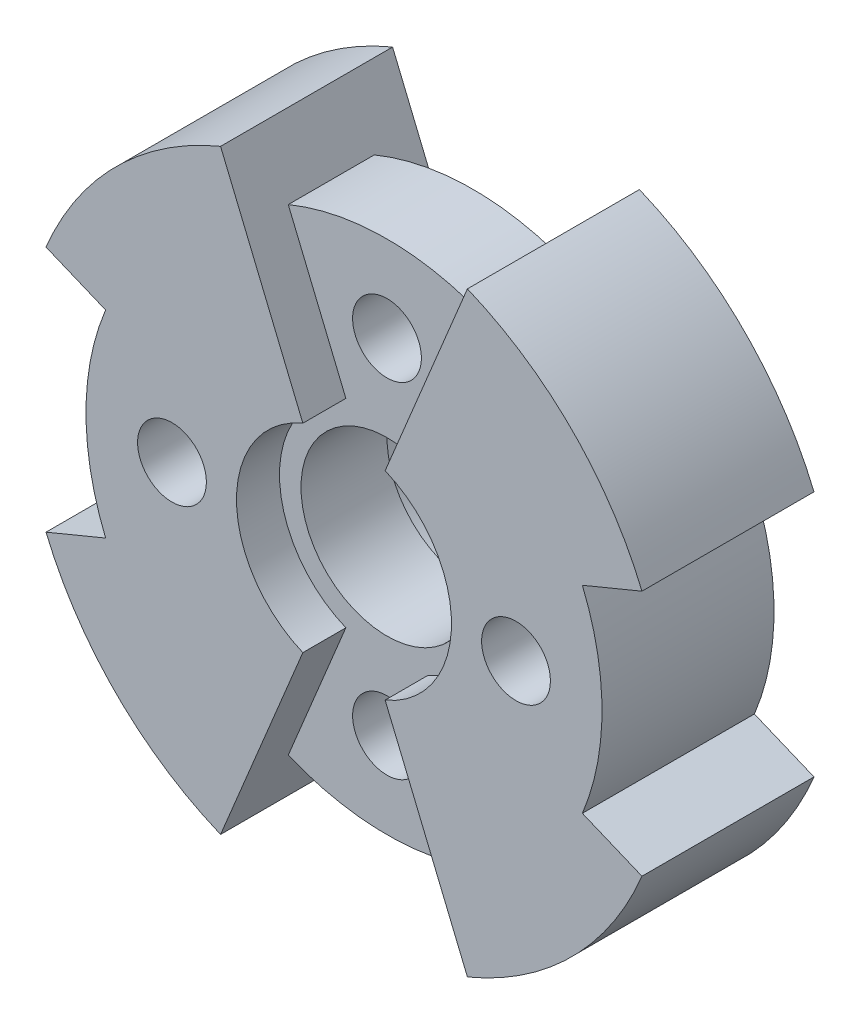
ISO-10303-21;
HEADER;
FILE_DESCRIPTION(('STEP AP214'),'2;1');
FILE_NAME('part.step','',(''),(''),'','','');
FILE_SCHEMA(('AUTOMOTIVE_DESIGN { 1 0 10303 214 1 1 1 1 }'));
ENDSEC;
DATA;
#1=APPLICATION_CONTEXT('core data for automotive mechanical design processes');
#2=APPLICATION_PROTOCOL_DEFINITION('international standard','automotive_design',2000,#1);
#3=PRODUCT_CONTEXT('',#1,'mechanical');
#4=PRODUCT('Part','Part','',(#3));
#5=PRODUCT_RELATED_PRODUCT_CATEGORY('part','',(#4));
#6=PRODUCT_DEFINITION_FORMATION('','',#4);
#7=PRODUCT_DEFINITION_CONTEXT('part definition',#1,'design');
#8=PRODUCT_DEFINITION('design','',#6,#7);
#9=PRODUCT_DEFINITION_SHAPE('','',#8);
#10=(LENGTH_UNIT() NAMED_UNIT(*) SI_UNIT(.MILLI.,.METRE.));
#11=(NAMED_UNIT(*) PLANE_ANGLE_UNIT() SI_UNIT($,.RADIAN.));
#12=(NAMED_UNIT(*) SI_UNIT($,.STERADIAN.) SOLID_ANGLE_UNIT());
#13=UNCERTAINTY_MEASURE_WITH_UNIT(LENGTH_MEASURE(1.E-05),#10,'distance_accuracy_value','');
#14=(GEOMETRIC_REPRESENTATION_CONTEXT(3) GLOBAL_UNCERTAINTY_ASSIGNED_CONTEXT((#13)) GLOBAL_UNIT_ASSIGNED_CONTEXT((#10,
#11,#12)) REPRESENTATION_CONTEXT('',''));
#15=CARTESIAN_POINT('',(0.,0.,0.));
#16=DIRECTION('',(0.,0.,1.));
#17=DIRECTION('',(1.,0.,0.));
#18=AXIS2_PLACEMENT_3D('',#15,#16,#17);
#19=CARTESIAN_POINT('',(0.,0.,508.));
#20=DIRECTION('',(0.,0.,-1.));
#21=DIRECTION('',(-1.,0.,0.));
#22=AXIS2_PLACEMENT_3D('',#19,#20,#21);
#23=CYLINDRICAL_SURFACE('',#22,635.);
#24=DIRECTION('',(0.,0.,-1.));
#25=VECTOR('',#24,1.);
#26=CARTESIAN_POINT('',(-243.003979551828,586.663503144669,508.));
#27=LINE('',#26,#25);
#28=CARTESIAN_POINT('',(-243.003979551828,586.663503144669,-254.));
#29=VERTEX_POINT('',#28);
#30=CARTESIAN_POINT('',(-243.003979551828,586.663503144669,-508.));
#31=VERTEX_POINT('',#30);
#32=EDGE_CURVE('E103',#29,#31,#27,.T.);
#33=ORIENTED_EDGE('',*,*,#32,.F.);
#34=CARTESIAN_POINT('',(0.,0.,-254.));
#35=DIRECTION('',(0.,0.,1.));
#36=DIRECTION('',(1.,0.,0.));
#37=AXIS2_PLACEMENT_3D('',#34,#35,#36);
#38=CIRCLE('',#37,635.);
#39=CARTESIAN_POINT('',(-243.003979551828,-586.663503144669,-254.));
#40=VERTEX_POINT('',#39);
#41=EDGE_CURVE('E281',#29,#40,#38,.T.);
#42=ORIENTED_EDGE('',*,*,#41,.T.);
#43=DIRECTION('',(0.,0.,-1.));
#44=VECTOR('',#43,1.);
#45=CARTESIAN_POINT('',(-243.003979551828,-586.663503144669,508.));
#46=LINE('',#45,#44);
#47=CARTESIAN_POINT('',(-243.003979551828,-586.663503144669,-508.));
#48=VERTEX_POINT('',#47);
#49=EDGE_CURVE('E204',#40,#48,#46,.T.);
#50=ORIENTED_EDGE('',*,*,#49,.T.);
#51=CARTESIAN_POINT('',(0.,0.,-508.));
#52=DIRECTION('',(0.,0.,1.));
#53=DIRECTION('',(1.,0.,0.));
#54=AXIS2_PLACEMENT_3D('',#51,#52,#53);
#55=CIRCLE('',#54,635.);
#56=EDGE_CURVE('E193',#31,#48,#55,.T.);
#57=ORIENTED_EDGE('',*,*,#56,.F.);
#58=EDGE_LOOP('',(#33,#42,#50,#57));
#59=FACE_BOUND('',#58,.T.);
#60=ADVANCED_FACE('F43',(#59),#23,.F.);
#61=CARTESIAN_POINT('',(0.,0.,508.));
#62=DIRECTION('',(-0.923879532511289,-0.382683432365084,0.));
#63=DIRECTION('',(0.382683432365084,-0.923879532511289,0.));
#64=AXIS2_PLACEMENT_3D('',#61,#62,#63);
#65=PLANE('',#64);
#66=CARTESIAN_POINT('',(-243.003979551828,586.663503144669,508.));
#67=VERTEX_POINT('',#66);
#68=CARTESIAN_POINT('',(-243.003979551828,586.663503144669,254.));
#69=VERTEX_POINT('',#68);
#70=EDGE_CURVE('E68',#67,#69,#27,.T.);
#71=ORIENTED_EDGE('',*,*,#70,.T.);
#72=DIRECTION('',(-0.382683432365084,0.923879532511289,0.));
#73=VECTOR('',#72,1.);
#74=CARTESIAN_POINT('',(0.,0.,254.));
#75=LINE('',#74,#73);
#76=CARTESIAN_POINT('',(-583.209550924388,1407.9924075472,254.));
#77=VERTEX_POINT('',#76);
#78=EDGE_CURVE('E323',#69,#77,#75,.T.);
#79=ORIENTED_EDGE('',*,*,#78,.T.);
#80=DIRECTION('',(0.,0.,-1.));
#81=VECTOR('',#80,1.);
#82=CARTESIAN_POINT('',(-583.209550924388,1407.9924075472,254.));
#83=LINE('',#82,#81);
#84=CARTESIAN_POINT('',(-583.209550924388,1407.9924075472,-254.));
#85=VERTEX_POINT('',#84);
#86=EDGE_CURVE('E249',#77,#85,#83,.T.);
#87=ORIENTED_EDGE('',*,*,#86,.T.);
#88=DIRECTION('',(-0.382683432365084,0.923879532511289,0.));
#89=VECTOR('',#88,1.);
#90=CARTESIAN_POINT('',(0.,0.,-254.));
#91=LINE('',#90,#89);
#92=EDGE_CURVE('E282',#29,#85,#91,.T.);
#93=ORIENTED_EDGE('',*,*,#92,.F.);
#94=ORIENTED_EDGE('',*,*,#32,.T.);
#95=DIRECTION('',(-0.382683432365084,0.923879532511289,0.));
#96=VECTOR('',#95,1.);
#97=CARTESIAN_POINT('',(0.,0.,-508.));
#98=LINE('',#97,#96);
#99=CARTESIAN_POINT('',(-729.011938655485,1759.99050943401,-508.));
#100=VERTEX_POINT('',#99);
#101=EDGE_CURVE('E170',#31,#100,#98,.T.);
#102=ORIENTED_EDGE('',*,*,#101,.T.);
#103=DIRECTION('',(0.,0.,-1.));
#104=VECTOR('',#103,1.);
#105=CARTESIAN_POINT('',(-729.011938655485,1759.99050943401,508.));
#106=LINE('',#105,#104);
#107=CARTESIAN_POINT('',(-729.011938655485,1759.99050943401,508.));
#108=VERTEX_POINT('',#107);
#109=EDGE_CURVE('E11',#108,#100,#106,.T.);
#110=ORIENTED_EDGE('',*,*,#109,.F.);
#111=DIRECTION('',(-0.382683432365084,0.923879532511289,0.));
#112=VECTOR('',#111,1.);
#113=CARTESIAN_POINT('',(0.,0.,508.));
#114=LINE('',#113,#112);
#115=EDGE_CURVE('E201',#67,#108,#114,.T.);
#116=ORIENTED_EDGE('',*,*,#115,.F.);
#117=EDGE_LOOP('',(#71,#79,#87,#93,#94,#102,#110,#116));
#118=FACE_BOUND('',#117,.T.);
#119=ADVANCED_FACE('F45',(#118),#65,.F.);
#120=CARTESIAN_POINT('',(0.,0.,508.));
#121=DIRECTION('',(0.,0.,-1.));
#122=DIRECTION('',(-1.,0.,0.));
#123=AXIS2_PLACEMENT_3D('',#120,#121,#122);
#124=CYLINDRICAL_SURFACE('',#123,1905.);
#125=CARTESIAN_POINT('',(0.,0.,-508.));
#126=DIRECTION('',(0.,0.,1.));
#127=DIRECTION('',(1.,0.,0.));
#128=AXIS2_PLACEMENT_3D('',#125,#126,#127);
#129=CIRCLE('',#128,1905.);
#130=CARTESIAN_POINT('',(-1759.990509434,729.011938655497,-508.));
#131=VERTEX_POINT('',#130);
#132=EDGE_CURVE('E173',#100,#131,#129,.T.);
#133=ORIENTED_EDGE('',*,*,#132,.T.);
#134=DIRECTION('',(0.,0.,-1.));
#135=VECTOR('',#134,1.);
#136=CARTESIAN_POINT('',(-1759.990509434,729.011938655497,508.));
#137=LINE('',#136,#135);
#138=CARTESIAN_POINT('',(-1759.990509434,729.011938655497,508.));
#139=VERTEX_POINT('',#138);
#140=EDGE_CURVE('E52',#139,#131,#137,.T.);
#141=ORIENTED_EDGE('',*,*,#140,.F.);
#142=CARTESIAN_POINT('',(0.,0.,508.));
#143=DIRECTION('',(0.,0.,1.));
#144=DIRECTION('',(1.,0.,0.));
#145=AXIS2_PLACEMENT_3D('',#142,#143,#144);
#146=CIRCLE('',#145,1905.);
#147=EDGE_CURVE('E111',#108,#139,#146,.T.);
#148=ORIENTED_EDGE('',*,*,#147,.F.);
#149=ORIENTED_EDGE('',*,*,#109,.T.);
#150=EDGE_LOOP('',(#133,#141,#148,#149));
#151=FACE_BOUND('',#150,.T.);
#152=ADVANCED_FACE('F222',(#151),#124,.T.);
#153=CARTESIAN_POINT('',(3.39891166203445E-13,8.20569863179165E-13,508.));
#154=DIRECTION('',(-0.38268343236509,-0.923879532511287,0.));
#155=DIRECTION('',(0.923879532511287,-0.38268343236509,0.));
#156=AXIS2_PLACEMENT_3D('',#153,#154,#155);
#157=PLANE('',#156);
#158=DIRECTION('',(-0.923879532511287,0.38268343236509,0.));
#159=VECTOR('',#158,1.);
#160=CARTESIAN_POINT('',(3.39891166203445E-13,8.20569863179165E-13,-508.));
#161=LINE('',#160,#159);
#162=CARTESIAN_POINT('',(-1407.9924075472,583.209550924398,-508.));
#163=VERTEX_POINT('',#162);
#164=EDGE_CURVE('E178',#163,#131,#161,.T.);
#165=ORIENTED_EDGE('',*,*,#164,.F.);
#166=DIRECTION('',(0.,0.,-1.));
#167=VECTOR('',#166,1.);
#168=CARTESIAN_POINT('',(-1407.9924075472,583.209550924398,508.));
#169=LINE('',#168,#167);
#170=CARTESIAN_POINT('',(-1407.9924075472,583.209550924398,508.));
#171=VERTEX_POINT('',#170);
#172=EDGE_CURVE('E213',#171,#163,#169,.T.);
#173=ORIENTED_EDGE('',*,*,#172,.F.);
#174=DIRECTION('',(-0.923879532511287,0.38268343236509,0.));
#175=VECTOR('',#174,1.);
#176=CARTESIAN_POINT('',(3.39891166203445E-13,8.20569863179165E-13,508.));
#177=LINE('',#176,#175);
#178=EDGE_CURVE('E221',#171,#139,#177,.T.);
#179=ORIENTED_EDGE('',*,*,#178,.T.);
#180=ORIENTED_EDGE('',*,*,#140,.T.);
#181=EDGE_LOOP('',(#165,#173,#179,#180));
#182=FACE_BOUND('',#181,.T.);
#183=ADVANCED_FACE('F219',(#182),#157,.T.);
#184=CARTESIAN_POINT('',(0.,0.,508.));
#185=DIRECTION('',(0.,0.,-1.));
#186=DIRECTION('',(-1.,0.,0.));
#187=AXIS2_PLACEMENT_3D('',#184,#185,#186);
#188=CYLINDRICAL_SURFACE('',#187,1524.);
#189=CARTESIAN_POINT('',(0.,0.,-508.));
#190=DIRECTION('',(0.,0.,1.));
#191=DIRECTION('',(1.,0.,0.));
#192=AXIS2_PLACEMENT_3D('',#189,#190,#191);
#193=CIRCLE('',#192,1524.);
#194=CARTESIAN_POINT('',(-1407.9924075472,-583.209550924398,-508.));
#195=VERTEX_POINT('',#194);
#196=EDGE_CURVE('E182',#163,#195,#193,.T.);
#197=ORIENTED_EDGE('',*,*,#196,.T.);
#198=DIRECTION('',(0.,0.,-1.));
#199=VECTOR('',#198,1.);
#200=CARTESIAN_POINT('',(-1407.9924075472,-583.209550924398,508.));
#201=LINE('',#200,#199);
#202=CARTESIAN_POINT('',(-1407.9924075472,-583.209550924398,508.));
#203=VERTEX_POINT('',#202);
#204=EDGE_CURVE('E209',#203,#195,#201,.T.);
#205=ORIENTED_EDGE('',*,*,#204,.F.);
#206=CARTESIAN_POINT('',(0.,0.,508.));
#207=DIRECTION('',(0.,0.,1.));
#208=DIRECTION('',(1.,0.,0.));
#209=AXIS2_PLACEMENT_3D('',#206,#207,#208);
#210=CIRCLE('',#209,1524.);
#211=EDGE_CURVE('E236',#171,#203,#210,.T.);
#212=ORIENTED_EDGE('',*,*,#211,.F.);
#213=ORIENTED_EDGE('',*,*,#172,.T.);
#214=EDGE_LOOP('',(#197,#205,#212,#213));
#215=FACE_BOUND('',#214,.T.);
#216=ADVANCED_FACE('F231',(#215),#188,.T.);
#217=CARTESIAN_POINT('',(3.39891166203445E-13,-8.20569863179165E-13,508.));
#218=DIRECTION('',(0.38268343236509,-0.923879532511287,0.));
#219=DIRECTION('',(0.923879532511287,0.38268343236509,0.));
#220=AXIS2_PLACEMENT_3D('',#217,#218,#219);
#221=PLANE('',#220);
#222=DIRECTION('',(-0.923879532511287,-0.38268343236509,0.));
#223=VECTOR('',#222,1.);
#224=CARTESIAN_POINT('',(3.39891166203445E-13,-8.20569863179165E-13,-508.));
#225=LINE('',#224,#223);
#226=CARTESIAN_POINT('',(-1759.990509434,-729.011938655497,-508.));
#227=VERTEX_POINT('',#226);
#228=EDGE_CURVE('E185',#195,#227,#225,.T.);
#229=ORIENTED_EDGE('',*,*,#228,.T.);
#230=DIRECTION('',(0.,0.,-1.));
#231=VECTOR('',#230,1.);
#232=CARTESIAN_POINT('',(-1759.990509434,-729.011938655497,508.));
#233=LINE('',#232,#231);
#234=CARTESIAN_POINT('',(-1759.990509434,-729.011938655497,508.));
#235=VERTEX_POINT('',#234);
#236=EDGE_CURVE('E153',#235,#227,#233,.T.);
#237=ORIENTED_EDGE('',*,*,#236,.F.);
#238=DIRECTION('',(-0.923879532511287,-0.38268343236509,0.));
#239=VECTOR('',#238,1.);
#240=CARTESIAN_POINT('',(3.39891166203445E-13,-8.20569863179165E-13,508.));
#241=LINE('',#240,#239);
#242=EDGE_CURVE('E138',#203,#235,#241,.T.);
#243=ORIENTED_EDGE('',*,*,#242,.F.);
#244=ORIENTED_EDGE('',*,*,#204,.T.);
#245=EDGE_LOOP('',(#229,#237,#243,#244));
#246=FACE_BOUND('',#245,.T.);
#247=ADVANCED_FACE('F234',(#246),#221,.F.);
#248=CARTESIAN_POINT('',(0.,0.,508.));
#249=DIRECTION('',(0.,0.,-1.));
#250=DIRECTION('',(-1.,0.,0.));
#251=AXIS2_PLACEMENT_3D('',#248,#249,#250);
#252=CYLINDRICAL_SURFACE('',#251,1905.);
#253=CARTESIAN_POINT('',(0.,0.,-508.));
#254=DIRECTION('',(0.,0.,1.));
#255=DIRECTION('',(1.,0.,0.));
#256=AXIS2_PLACEMENT_3D('',#253,#254,#255);
#257=CIRCLE('',#256,1905.);
#258=CARTESIAN_POINT('',(-729.011938655485,-1759.99050943401,-508.));
#259=VERTEX_POINT('',#258);
#260=EDGE_CURVE('E148',#227,#259,#257,.T.);
#261=ORIENTED_EDGE('',*,*,#260,.T.);
#262=DIRECTION('',(0.,0.,-1.));
#263=VECTOR('',#262,1.);
#264=CARTESIAN_POINT('',(-729.011938655485,-1759.99050943401,508.));
#265=LINE('',#264,#263);
#266=CARTESIAN_POINT('',(-729.011938655485,-1759.99050943401,508.));
#267=VERTEX_POINT('',#266);
#268=EDGE_CURVE('E145',#267,#259,#265,.T.);
#269=ORIENTED_EDGE('',*,*,#268,.F.);
#270=CARTESIAN_POINT('',(0.,0.,508.));
#271=DIRECTION('',(0.,0.,1.));
#272=DIRECTION('',(1.,0.,0.));
#273=AXIS2_PLACEMENT_3D('',#270,#271,#272);
#274=CIRCLE('',#273,1905.);
#275=EDGE_CURVE('E130',#235,#267,#274,.T.);
#276=ORIENTED_EDGE('',*,*,#275,.F.);
#277=ORIENTED_EDGE('',*,*,#236,.T.);
#278=EDGE_LOOP('',(#261,#269,#276,#277));
#279=FACE_BOUND('',#278,.T.);
#280=ADVANCED_FACE('F146',(#279),#252,.T.);
#281=CARTESIAN_POINT('',(0.,0.,508.));
#282=DIRECTION('',(0.923879532511289,-0.382683432365084,0.));
#283=DIRECTION('',(0.382683432365084,0.923879532511289,0.));
#284=AXIS2_PLACEMENT_3D('',#281,#282,#283);
#285=PLANE('',#284);
#286=DIRECTION('',(-0.382683432365084,-0.923879532511289,0.));
#287=VECTOR('',#286,1.);
#288=CARTESIAN_POINT('',(0.,0.,254.));
#289=LINE('',#288,#287);
#290=CARTESIAN_POINT('',(-243.003979551828,-586.663503144669,254.));
#291=VERTEX_POINT('',#290);
#292=CARTESIAN_POINT('',(-583.209550924388,-1407.9924075472,254.));
#293=VERTEX_POINT('',#292);
#294=EDGE_CURVE('E318',#291,#293,#289,.T.);
#295=ORIENTED_EDGE('',*,*,#294,.F.);
#296=CARTESIAN_POINT('',(-243.003979551828,-586.663503144669,508.));
#297=VERTEX_POINT('',#296);
#298=EDGE_CURVE('E154',#297,#291,#46,.T.);
#299=ORIENTED_EDGE('',*,*,#298,.F.);
#300=DIRECTION('',(-0.382683432365084,-0.923879532511289,0.));
#301=VECTOR('',#300,1.);
#302=CARTESIAN_POINT('',(0.,0.,508.));
#303=LINE('',#302,#301);
#304=EDGE_CURVE('E136',#297,#267,#303,.T.);
#305=ORIENTED_EDGE('',*,*,#304,.T.);
#306=ORIENTED_EDGE('',*,*,#268,.T.);
#307=DIRECTION('',(-0.382683432365084,-0.923879532511289,0.));
#308=VECTOR('',#307,1.);
#309=CARTESIAN_POINT('',(0.,0.,-508.));
#310=LINE('',#309,#308);
#311=EDGE_CURVE('E190',#48,#259,#310,.T.);
#312=ORIENTED_EDGE('',*,*,#311,.F.);
#313=ORIENTED_EDGE('',*,*,#49,.F.);
#314=DIRECTION('',(-0.382683432365084,-0.923879532511289,0.));
#315=VECTOR('',#314,1.);
#316=CARTESIAN_POINT('',(0.,0.,-254.));
#317=LINE('',#316,#315);
#318=CARTESIAN_POINT('',(-583.209550924388,-1407.9924075472,-254.));
#319=VERTEX_POINT('',#318);
#320=EDGE_CURVE('E59',#40,#319,#317,.T.);
#321=ORIENTED_EDGE('',*,*,#320,.T.);
#322=DIRECTION('',(0.,0.,-1.));
#323=VECTOR('',#322,1.);
#324=CARTESIAN_POINT('',(-583.209550924388,-1407.9924075472,254.));
#325=LINE('',#324,#323);
#326=EDGE_CURVE('E253',#293,#319,#325,.T.);
#327=ORIENTED_EDGE('',*,*,#326,.F.);
#328=EDGE_LOOP('',(#295,#299,#305,#306,#312,#313,#321,#327));
#329=FACE_BOUND('',#328,.T.);
#330=ADVANCED_FACE('F157',(#329),#285,.T.);
#331=CARTESIAN_POINT('',(0.,0.,254.));
#332=DIRECTION('',(0.,0.,1.));
#333=DIRECTION('',(1.,0.,0.));
#334=AXIS2_PLACEMENT_3D('',#331,#332,#333);
#335=CIRCLE('',#334,635.);
#336=EDGE_CURVE('E322',#69,#291,#335,.T.);
#337=ORIENTED_EDGE('',*,*,#336,.F.);
#338=ORIENTED_EDGE('',*,*,#70,.F.);
#339=CARTESIAN_POINT('',(0.,0.,508.));
#340=DIRECTION('',(0.,0.,1.));
#341=DIRECTION('',(1.,0.,0.));
#342=AXIS2_PLACEMENT_3D('',#339,#340,#341);
#343=CIRCLE('',#342,635.);
#344=EDGE_CURVE('E160',#67,#297,#343,.T.);
#345=ORIENTED_EDGE('',*,*,#344,.T.);
#346=ORIENTED_EDGE('',*,*,#298,.T.);
#347=EDGE_LOOP('',(#337,#338,#345,#346));
#348=FACE_BOUND('',#347,.T.);
#349=ADVANCED_FACE('F588',(#348),#23,.F.);
#350=CARTESIAN_POINT('',(-1016.,-1.86636172190056E-13,508.));
#351=DIRECTION('',(0.,0.,-1.));
#352=DIRECTION('',(-1.,0.,0.));
#353=AXIS2_PLACEMENT_3D('',#350,#351,#352);
#354=CYLINDRICAL_SURFACE('',#353,203.20000000001);
#355=CARTESIAN_POINT('',(-1016.,-1.86636172190056E-13,508.));
#356=DIRECTION('',(0.,0.,1.));
#357=DIRECTION('',(1.,0.,0.));
#358=AXIS2_PLACEMENT_3D('',#355,#356,#357);
#359=CIRCLE('',#358,203.20000000001);
#360=CARTESIAN_POINT('',(-812.79999999999,-1.86636172190056E-13,508.));
#361=VERTEX_POINT('',#360);
#362=EDGE_CURVE('E163',#361,#361,#359,.T.);
#363=ORIENTED_EDGE('',*,*,#362,.T.);
#364=EDGE_LOOP('',(#363));
#365=FACE_BOUND('',#364,.T.);
#366=CARTESIAN_POINT('',(-1016.,-1.86636172190056E-13,-508.));
#367=DIRECTION('',(0.,0.,1.));
#368=DIRECTION('',(1.,0.,0.));
#369=AXIS2_PLACEMENT_3D('',#366,#367,#368);
#370=CIRCLE('',#369,203.20000000001);
#371=CARTESIAN_POINT('',(-812.79999999999,-1.86636172190056E-13,-508.));
#372=VERTEX_POINT('',#371);
#373=EDGE_CURVE('E197',#372,#372,#370,.T.);
#374=ORIENTED_EDGE('',*,*,#373,.F.);
#375=EDGE_LOOP('',(#374));
#376=FACE_BOUND('',#375,.T.);
#377=ADVANCED_FACE('F595',(#365,#376),#354,.F.);
#378=CARTESIAN_POINT('',(0.,0.,508.));
#379=DIRECTION('',(0.,0.,1.));
#380=DIRECTION('',(1.,0.,0.));
#381=AXIS2_PLACEMENT_3D('',#378,#379,#380);
#382=PLANE('',#381);
#383=ORIENTED_EDGE('',*,*,#115,.T.);
#384=ORIENTED_EDGE('',*,*,#147,.T.);
#385=ORIENTED_EDGE('',*,*,#178,.F.);
#386=ORIENTED_EDGE('',*,*,#211,.T.);
#387=ORIENTED_EDGE('',*,*,#242,.T.);
#388=ORIENTED_EDGE('',*,*,#275,.T.);
#389=ORIENTED_EDGE('',*,*,#304,.F.);
#390=ORIENTED_EDGE('',*,*,#344,.F.);
#391=EDGE_LOOP('',(#383,#384,#385,#386,#387,#388,#389,#390));
#392=FACE_BOUND('',#391,.T.);
#393=ORIENTED_EDGE('',*,*,#362,.F.);
#394=EDGE_LOOP('',(#393));
#395=FACE_BOUND('',#394,.T.);
#396=ADVANCED_FACE('F132',(#392,#395),#382,.T.);
#397=CARTESIAN_POINT('',(0.,0.,-508.));
#398=DIRECTION('',(0.,0.,1.));
#399=DIRECTION('',(1.,0.,0.));
#400=AXIS2_PLACEMENT_3D('',#397,#398,#399);
#401=PLANE('',#400);
#402=ORIENTED_EDGE('',*,*,#101,.F.);
#403=ORIENTED_EDGE('',*,*,#56,.T.);
#404=ORIENTED_EDGE('',*,*,#311,.T.);
#405=ORIENTED_EDGE('',*,*,#260,.F.);
#406=ORIENTED_EDGE('',*,*,#228,.F.);
#407=ORIENTED_EDGE('',*,*,#196,.F.);
#408=ORIENTED_EDGE('',*,*,#164,.T.);
#409=ORIENTED_EDGE('',*,*,#132,.F.);
#410=EDGE_LOOP('',(#402,#403,#404,#405,#406,#407,#408,#409));
#411=FACE_BOUND('',#410,.T.);
#412=ORIENTED_EDGE('',*,*,#373,.T.);
#413=EDGE_LOOP('',(#412));
#414=FACE_BOUND('',#413,.T.);
#415=ADVANCED_FACE('F226',(#411,#414),#401,.F.);
#416=CARTESIAN_POINT('',(0.,0.,254.));
#417=DIRECTION('',(0.,0.,-1.));
#418=DIRECTION('',(-1.,0.,0.));
#419=AXIS2_PLACEMENT_3D('',#416,#417,#418);
#420=CYLINDRICAL_SURFACE('',#419,1524.);
#421=CARTESIAN_POINT('',(0.,0.,-254.));
#422=DIRECTION('',(0.,0.,1.));
#423=DIRECTION('',(1.,0.,0.));
#424=AXIS2_PLACEMENT_3D('',#421,#422,#423);
#425=CIRCLE('',#424,1524.);
#426=CARTESIAN_POINT('',(583.209550924388,1407.9924075472,-254.));
#427=VERTEX_POINT('',#426);
#428=EDGE_CURVE('E286',#427,#85,#425,.T.);
#429=ORIENTED_EDGE('',*,*,#428,.T.);
#430=ORIENTED_EDGE('',*,*,#86,.F.);
#431=CARTESIAN_POINT('',(0.,0.,254.));
#432=DIRECTION('',(0.,0.,1.));
#433=DIRECTION('',(1.,0.,0.));
#434=AXIS2_PLACEMENT_3D('',#431,#432,#433);
#435=CIRCLE('',#434,1524.);
#436=CARTESIAN_POINT('',(583.209550924388,1407.9924075472,254.));
#437=VERTEX_POINT('',#436);
#438=EDGE_CURVE('E327',#437,#77,#435,.T.);
#439=ORIENTED_EDGE('',*,*,#438,.F.);
#440=DIRECTION('',(0.,0.,-1.));
#441=VECTOR('',#440,1.);
#442=CARTESIAN_POINT('',(583.209550924388,1407.9924075472,254.));
#443=LINE('',#442,#441);
#444=EDGE_CURVE('E174',#437,#427,#443,.T.);
#445=ORIENTED_EDGE('',*,*,#444,.T.);
#446=EDGE_LOOP('',(#429,#430,#439,#445));
#447=FACE_BOUND('',#446,.T.);
#448=ADVANCED_FACE('F612',(#447),#420,.T.);
#449=CARTESIAN_POINT('',(0.,0.,254.));
#450=DIRECTION('',(0.,0.,-1.));
#451=DIRECTION('',(-1.,0.,0.));
#452=AXIS2_PLACEMENT_3D('',#449,#450,#451);
#453=CYLINDRICAL_SURFACE('',#452,1524.);
#454=CARTESIAN_POINT('',(0.,0.,-254.));
#455=DIRECTION('',(0.,0.,1.));
#456=DIRECTION('',(1.,0.,0.));
#457=AXIS2_PLACEMENT_3D('',#454,#455,#456);
#458=CIRCLE('',#457,1524.);
#459=CARTESIAN_POINT('',(583.209550924388,-1407.9924075472,-254.));
#460=VERTEX_POINT('',#459);
#461=EDGE_CURVE('E275',#319,#460,#458,.T.);
#462=ORIENTED_EDGE('',*,*,#461,.T.);
#463=DIRECTION('',(0.,0.,-1.));
#464=VECTOR('',#463,1.);
#465=CARTESIAN_POINT('',(583.209550924388,-1407.9924075472,254.));
#466=LINE('',#465,#464);
#467=CARTESIAN_POINT('',(583.209550924388,-1407.9924075472,254.));
#468=VERTEX_POINT('',#467);
#469=EDGE_CURVE('E257',#468,#460,#466,.T.);
#470=ORIENTED_EDGE('',*,*,#469,.F.);
#471=CARTESIAN_POINT('',(0.,0.,254.));
#472=DIRECTION('',(0.,0.,1.));
#473=DIRECTION('',(1.,0.,0.));
#474=AXIS2_PLACEMENT_3D('',#471,#472,#473);
#475=CIRCLE('',#474,1524.);
#476=EDGE_CURVE('E314',#293,#468,#475,.T.);
#477=ORIENTED_EDGE('',*,*,#476,.F.);
#478=ORIENTED_EDGE('',*,*,#326,.T.);
#479=EDGE_LOOP('',(#462,#470,#477,#478));
#480=FACE_BOUND('',#479,.T.);
#481=ADVANCED_FACE('F540',(#480),#453,.T.);
#482=CARTESIAN_POINT('',(-7.09469008052925E-12,-1016.,254.));
#483=DIRECTION('',(0.,0.,-1.));
#484=DIRECTION('',(-1.,0.,0.));
#485=AXIS2_PLACEMENT_3D('',#482,#483,#484);
#486=CYLINDRICAL_SURFACE('',#485,203.2);
#487=CARTESIAN_POINT('',(-7.09469008052925E-12,-1016.,254.));
#488=DIRECTION('',(0.,0.,1.));
#489=DIRECTION('',(1.,0.,0.));
#490=AXIS2_PLACEMENT_3D('',#487,#488,#489);
#491=CIRCLE('',#490,203.2);
#492=CARTESIAN_POINT('',(203.199999999993,-1016.,254.));
#493=VERTEX_POINT('',#492);
#494=EDGE_CURVE('E306',#493,#493,#491,.T.);
#495=ORIENTED_EDGE('',*,*,#494,.T.);
#496=EDGE_LOOP('',(#495));
#497=FACE_BOUND('',#496,.T.);
#498=CARTESIAN_POINT('',(-7.09469008052925E-12,-1016.,-254.));
#499=DIRECTION('',(0.,0.,1.));
#500=DIRECTION('',(1.,0.,0.));
#501=AXIS2_PLACEMENT_3D('',#498,#499,#500);
#502=CIRCLE('',#501,203.2);
#503=CARTESIAN_POINT('',(203.199999999993,-1016.,-254.));
#504=VERTEX_POINT('',#503);
#505=EDGE_CURVE('E267',#504,#504,#502,.T.);
#506=ORIENTED_EDGE('',*,*,#505,.F.);
#507=EDGE_LOOP('',(#506));
#508=FACE_BOUND('',#507,.T.);
#509=ADVANCED_FACE('F620',(#497,#508),#486,.F.);
#510=CARTESIAN_POINT('',(0.,0.,254.));
#511=DIRECTION('',(0.,0.,-1.));
#512=DIRECTION('',(-1.,0.,0.));
#513=AXIS2_PLACEMENT_3D('',#510,#511,#512);
#514=CYLINDRICAL_SURFACE('',#513,508.);
#515=CARTESIAN_POINT('',(0.,0.,254.));
#516=DIRECTION('',(0.,0.,1.));
#517=DIRECTION('',(1.,0.,0.));
#518=AXIS2_PLACEMENT_3D('',#515,#516,#517);
#519=CIRCLE('',#518,508.);
#520=CARTESIAN_POINT('',(508.,0.,254.));
#521=VERTEX_POINT('',#520);
#522=EDGE_CURVE('E266',#521,#521,#519,.T.);
#523=ORIENTED_EDGE('',*,*,#522,.T.);
#524=EDGE_LOOP('',(#523));
#525=FACE_BOUND('',#524,.T.);
#526=CARTESIAN_POINT('',(0.,0.,-254.));
#527=DIRECTION('',(0.,0.,1.));
#528=DIRECTION('',(1.,0.,0.));
#529=AXIS2_PLACEMENT_3D('',#526,#527,#528);
#530=CIRCLE('',#529,508.);
#531=CARTESIAN_POINT('',(508.,0.,-254.));
#532=VERTEX_POINT('',#531);
#533=EDGE_CURVE('E298',#532,#532,#530,.T.);
#534=ORIENTED_EDGE('',*,*,#533,.F.);
#535=EDGE_LOOP('',(#534));
#536=FACE_BOUND('',#535,.T.);
#537=ADVANCED_FACE('F625',(#525,#536),#514,.F.);
#538=CARTESIAN_POINT('',(0.,1016.,254.));
#539=DIRECTION('',(0.,0.,-1.));
#540=DIRECTION('',(-1.,0.,0.));
#541=AXIS2_PLACEMENT_3D('',#538,#539,#540);
#542=CYLINDRICAL_SURFACE('',#541,203.2);
#543=CARTESIAN_POINT('',(0.,1016.,254.));
#544=DIRECTION('',(0.,0.,1.));
#545=DIRECTION('',(1.,0.,0.));
#546=AXIS2_PLACEMENT_3D('',#543,#544,#545);
#547=CIRCLE('',#546,203.2);
#548=CARTESIAN_POINT('',(203.2,1016.,254.));
#549=VERTEX_POINT('',#548);
#550=EDGE_CURVE('E261',#549,#549,#547,.T.);
#551=ORIENTED_EDGE('',*,*,#550,.T.);
#552=EDGE_LOOP('',(#551));
#553=FACE_BOUND('',#552,.T.);
#554=CARTESIAN_POINT('',(0.,1016.,-254.));
#555=DIRECTION('',(0.,0.,1.));
#556=DIRECTION('',(1.,0.,0.));
#557=AXIS2_PLACEMENT_3D('',#554,#555,#556);
#558=CIRCLE('',#557,203.2);
#559=CARTESIAN_POINT('',(203.2,1016.,-254.));
#560=VERTEX_POINT('',#559);
#561=EDGE_CURVE('E262',#560,#560,#558,.T.);
#562=ORIENTED_EDGE('',*,*,#561,.F.);
#563=EDGE_LOOP('',(#562));
#564=FACE_BOUND('',#563,.T.);
#565=ADVANCED_FACE('F628',(#553,#564),#542,.F.);
#566=CARTESIAN_POINT('',(0.,0.,254.));
#567=DIRECTION('',(0.,0.,1.));
#568=DIRECTION('',(1.,0.,0.));
#569=AXIS2_PLACEMENT_3D('',#566,#567,#568);
#570=PLANE('',#569);
#571=ORIENTED_EDGE('',*,*,#522,.F.);
#572=EDGE_LOOP('',(#571));
#573=FACE_BOUND('',#572,.T.);
#574=CARTESIAN_POINT('',(243.003979551828,-586.663503144669,254.));
#575=VERTEX_POINT('',#574);
#576=CARTESIAN_POINT('',(243.003979551828,586.663503144669,254.));
#577=VERTEX_POINT('',#576);
#578=EDGE_CURVE('E335',#575,#577,#335,.T.);
#579=ORIENTED_EDGE('',*,*,#578,.T.);
#580=DIRECTION('',(0.382683432365084,0.923879532511289,0.));
#581=VECTOR('',#580,1.);
#582=CARTESIAN_POINT('',(0.,0.,254.));
#583=LINE('',#582,#581);
#584=EDGE_CURVE('E331',#577,#437,#583,.T.);
#585=ORIENTED_EDGE('',*,*,#584,.T.);
#586=ORIENTED_EDGE('',*,*,#438,.T.);
#587=ORIENTED_EDGE('',*,*,#78,.F.);
#588=ORIENTED_EDGE('',*,*,#336,.T.);
#589=ORIENTED_EDGE('',*,*,#294,.T.);
#590=ORIENTED_EDGE('',*,*,#476,.T.);
#591=DIRECTION('',(0.382683432365084,-0.923879532511289,0.));
#592=VECTOR('',#591,1.);
#593=CARTESIAN_POINT('',(0.,0.,254.));
#594=LINE('',#593,#592);
#595=EDGE_CURVE('E310',#575,#468,#594,.T.);
#596=ORIENTED_EDGE('',*,*,#595,.F.);
#597=EDGE_LOOP('',(#579,#585,#586,#587,#588,#589,#590,#596));
#598=FACE_BOUND('',#597,.T.);
#599=ORIENTED_EDGE('',*,*,#494,.F.);
#600=EDGE_LOOP('',(#599));
#601=FACE_BOUND('',#600,.T.);
#602=ORIENTED_EDGE('',*,*,#550,.F.);
#603=EDGE_LOOP('',(#602));
#604=FACE_BOUND('',#603,.T.);
#605=ADVANCED_FACE('F607',(#573,#598,#601,#604),#570,.T.);
#606=CARTESIAN_POINT('',(0.,0.,-254.));
#607=DIRECTION('',(0.,0.,1.));
#608=DIRECTION('',(1.,0.,0.));
#609=AXIS2_PLACEMENT_3D('',#606,#607,#608);
#610=PLANE('',#609);
#611=ORIENTED_EDGE('',*,*,#533,.T.);
#612=EDGE_LOOP('',(#611));
#613=FACE_BOUND('',#612,.T.);
#614=CARTESIAN_POINT('',(243.003979551828,-586.663503144669,-254.));
#615=VERTEX_POINT('',#614);
#616=CARTESIAN_POINT('',(243.003979551828,586.663503144669,-254.));
#617=VERTEX_POINT('',#616);
#618=EDGE_CURVE('E294',#615,#617,#38,.T.);
#619=ORIENTED_EDGE('',*,*,#618,.F.);
#620=DIRECTION('',(0.382683432365084,-0.923879532511289,0.));
#621=VECTOR('',#620,1.);
#622=CARTESIAN_POINT('',(0.,0.,-254.));
#623=LINE('',#622,#621);
#624=EDGE_CURVE('E271',#615,#460,#623,.T.);
#625=ORIENTED_EDGE('',*,*,#624,.T.);
#626=ORIENTED_EDGE('',*,*,#461,.F.);
#627=ORIENTED_EDGE('',*,*,#320,.F.);
#628=ORIENTED_EDGE('',*,*,#41,.F.);
#629=ORIENTED_EDGE('',*,*,#92,.T.);
#630=ORIENTED_EDGE('',*,*,#428,.F.);
#631=DIRECTION('',(0.382683432365084,0.923879532511289,0.));
#632=VECTOR('',#631,1.);
#633=CARTESIAN_POINT('',(0.,0.,-254.));
#634=LINE('',#633,#632);
#635=EDGE_CURVE('E290',#617,#427,#634,.T.);
#636=ORIENTED_EDGE('',*,*,#635,.F.);
#637=EDGE_LOOP('',(#619,#625,#626,#627,#628,#629,#630,#636));
#638=FACE_BOUND('',#637,.T.);
#639=ORIENTED_EDGE('',*,*,#505,.T.);
#640=EDGE_LOOP('',(#639));
#641=FACE_BOUND('',#640,.T.);
#642=ORIENTED_EDGE('',*,*,#561,.T.);
#643=EDGE_LOOP('',(#642));
#644=FACE_BOUND('',#643,.T.);
#645=ADVANCED_FACE('F542',(#613,#638,#641,#644),#610,.F.);
#646=CARTESIAN_POINT('',(0.,0.,508.));
#647=DIRECTION('',(0.,0.,-1.));
#648=DIRECTION('',(-1.,0.,0.));
#649=AXIS2_PLACEMENT_3D('',#646,#647,#648);
#650=CYLINDRICAL_SURFACE('',#649,635.);
#651=ORIENTED_EDGE('',*,*,#618,.T.);
#652=DIRECTION('',(0.,0.,-1.));
#653=VECTOR('',#652,1.);
#654=CARTESIAN_POINT('',(243.003979551828,586.663503144669,508.));
#655=LINE('',#654,#653);
#656=CARTESIAN_POINT('',(243.003979551828,586.663503144669,-508.));
#657=VERTEX_POINT('',#656);
#658=EDGE_CURVE('E345',#617,#657,#655,.T.);
#659=ORIENTED_EDGE('',*,*,#658,.T.);
#660=CARTESIAN_POINT('',(0.,0.,-508.));
#661=DIRECTION('',(0.,0.,1.));
#662=DIRECTION('',(1.,0.,0.));
#663=AXIS2_PLACEMENT_3D('',#660,#661,#662);
#664=CIRCLE('',#663,635.);
#665=CARTESIAN_POINT('',(243.003979551828,-586.663503144669,-508.));
#666=VERTEX_POINT('',#665);
#667=EDGE_CURVE('E405',#666,#657,#664,.T.);
#668=ORIENTED_EDGE('',*,*,#667,.F.);
#669=DIRECTION('',(0.,0.,-1.));
#670=VECTOR('',#669,1.);
#671=CARTESIAN_POINT('',(243.003979551828,-586.663503144669,508.));
#672=LINE('',#671,#670);
#673=EDGE_CURVE('E350',#615,#666,#672,.T.);
#674=ORIENTED_EDGE('',*,*,#673,.F.);
#675=EDGE_LOOP('',(#651,#659,#668,#674));
#676=FACE_BOUND('',#675,.T.);
#677=ADVANCED_FACE('F548',(#676),#650,.F.);
#678=CARTESIAN_POINT('',(0.,0.,508.));
#679=DIRECTION('',(-0.923879532511289,0.382683432365084,0.));
#680=DIRECTION('',(-0.382683432365084,-0.923879532511289,0.));
#681=AXIS2_PLACEMENT_3D('',#678,#679,#680);
#682=PLANE('',#681);
#683=ORIENTED_EDGE('',*,*,#444,.F.);
#684=ORIENTED_EDGE('',*,*,#584,.F.);
#685=CARTESIAN_POINT('',(243.003979551828,586.663503144669,508.));
#686=VERTEX_POINT('',#685);
#687=EDGE_CURVE('E302',#686,#577,#655,.T.);
#688=ORIENTED_EDGE('',*,*,#687,.F.);
#689=DIRECTION('',(0.382683432365084,0.923879532511289,0.));
#690=VECTOR('',#689,1.);
#691=CARTESIAN_POINT('',(0.,0.,508.));
#692=LINE('',#691,#690);
#693=CARTESIAN_POINT('',(729.011938655485,1759.99050943401,508.));
#694=VERTEX_POINT('',#693);
#695=EDGE_CURVE('E380',#686,#694,#692,.T.);
#696=ORIENTED_EDGE('',*,*,#695,.T.);
#697=DIRECTION('',(0.,0.,-1.));
#698=VECTOR('',#697,1.);
#699=CARTESIAN_POINT('',(729.011938655485,1759.99050943401,508.));
#700=LINE('',#699,#698);
#701=CARTESIAN_POINT('',(729.011938655485,1759.99050943401,-508.));
#702=VERTEX_POINT('',#701);
#703=EDGE_CURVE('E371',#694,#702,#700,.T.);
#704=ORIENTED_EDGE('',*,*,#703,.T.);
#705=DIRECTION('',(0.382683432365084,0.923879532511289,0.));
#706=VECTOR('',#705,1.);
#707=CARTESIAN_POINT('',(0.,0.,-508.));
#708=LINE('',#707,#706);
#709=EDGE_CURVE('E409',#657,#702,#708,.T.);
#710=ORIENTED_EDGE('',*,*,#709,.F.);
#711=ORIENTED_EDGE('',*,*,#658,.F.);
#712=ORIENTED_EDGE('',*,*,#635,.T.);
#713=EDGE_LOOP('',(#683,#684,#688,#696,#704,#710,#711,#712));
#714=FACE_BOUND('',#713,.T.);
#715=ADVANCED_FACE('F451',(#714),#682,.T.);
#716=ORIENTED_EDGE('',*,*,#687,.T.);
#717=ORIENTED_EDGE('',*,*,#578,.F.);
#718=CARTESIAN_POINT('',(243.003979551828,-586.663503144669,508.));
#719=VERTEX_POINT('',#718);
#720=EDGE_CURVE('E346',#719,#575,#672,.T.);
#721=ORIENTED_EDGE('',*,*,#720,.F.);
#722=CARTESIAN_POINT('',(0.,0.,508.));
#723=DIRECTION('',(0.,0.,1.));
#724=DIRECTION('',(1.,0.,0.));
#725=AXIS2_PLACEMENT_3D('',#722,#723,#724);
#726=CIRCLE('',#725,635.);
#727=EDGE_CURVE('E440',#719,#686,#726,.T.);
#728=ORIENTED_EDGE('',*,*,#727,.T.);
#729=EDGE_LOOP('',(#716,#717,#721,#728));
#730=FACE_BOUND('',#729,.T.);
#731=ADVANCED_FACE('F469',(#730),#650,.F.);
#732=CARTESIAN_POINT('',(0.,0.,508.));
#733=DIRECTION('',(0.923879532511289,0.382683432365084,0.));
#734=DIRECTION('',(-0.382683432365084,0.923879532511289,0.));
#735=AXIS2_PLACEMENT_3D('',#732,#733,#734);
#736=PLANE('',#735);
#737=ORIENTED_EDGE('',*,*,#595,.T.);
#738=ORIENTED_EDGE('',*,*,#469,.T.);
#739=ORIENTED_EDGE('',*,*,#624,.F.);
#740=ORIENTED_EDGE('',*,*,#673,.T.);
#741=DIRECTION('',(0.382683432365084,-0.923879532511289,0.));
#742=VECTOR('',#741,1.);
#743=CARTESIAN_POINT('',(0.,0.,-508.));
#744=LINE('',#743,#742);
#745=CARTESIAN_POINT('',(729.011938655485,-1759.99050943401,-508.));
#746=VERTEX_POINT('',#745);
#747=EDGE_CURVE('E401',#666,#746,#744,.T.);
#748=ORIENTED_EDGE('',*,*,#747,.T.);
#749=DIRECTION('',(0.,0.,-1.));
#750=VECTOR('',#749,1.);
#751=CARTESIAN_POINT('',(729.011938655485,-1759.99050943401,508.));
#752=LINE('',#751,#750);
#753=CARTESIAN_POINT('',(729.011938655485,-1759.99050943401,508.));
#754=VERTEX_POINT('',#753);
#755=EDGE_CURVE('E351',#754,#746,#752,.T.);
#756=ORIENTED_EDGE('',*,*,#755,.F.);
#757=DIRECTION('',(0.382683432365084,-0.923879532511289,0.));
#758=VECTOR('',#757,1.);
#759=CARTESIAN_POINT('',(0.,0.,508.));
#760=LINE('',#759,#758);
#761=EDGE_CURVE('E436',#719,#754,#760,.T.);
#762=ORIENTED_EDGE('',*,*,#761,.F.);
#763=ORIENTED_EDGE('',*,*,#720,.T.);
#764=EDGE_LOOP('',(#737,#738,#739,#740,#748,#756,#762,#763));
#765=FACE_BOUND('',#764,.T.);
#766=ADVANCED_FACE('F478',(#765),#736,.F.);
#767=CARTESIAN_POINT('',(0.,0.,508.));
#768=DIRECTION('',(0.,0.,-1.));
#769=DIRECTION('',(-1.,0.,0.));
#770=AXIS2_PLACEMENT_3D('',#767,#768,#769);
#771=CYLINDRICAL_SURFACE('',#770,1905.);
#772=CARTESIAN_POINT('',(0.,0.,-508.));
#773=DIRECTION('',(0.,0.,1.));
#774=DIRECTION('',(1.,0.,0.));
#775=AXIS2_PLACEMENT_3D('',#772,#773,#774);
#776=CIRCLE('',#775,1905.);
#777=CARTESIAN_POINT('',(1759.990509434,-729.011938655497,-508.));
#778=VERTEX_POINT('',#777);
#779=EDGE_CURVE('E397',#746,#778,#776,.T.);
#780=ORIENTED_EDGE('',*,*,#779,.T.);
#781=DIRECTION('',(0.,0.,-1.));
#782=VECTOR('',#781,1.);
#783=CARTESIAN_POINT('',(1759.990509434,-729.011938655497,508.));
#784=LINE('',#783,#782);
#785=CARTESIAN_POINT('',(1759.990509434,-729.011938655497,508.));
#786=VERTEX_POINT('',#785);
#787=EDGE_CURVE('E355',#786,#778,#784,.T.);
#788=ORIENTED_EDGE('',*,*,#787,.F.);
#789=CARTESIAN_POINT('',(0.,0.,508.));
#790=DIRECTION('',(0.,0.,1.));
#791=DIRECTION('',(1.,0.,0.));
#792=AXIS2_PLACEMENT_3D('',#789,#790,#791);
#793=CIRCLE('',#792,1905.);
#794=EDGE_CURVE('E432',#754,#786,#793,.T.);
#795=ORIENTED_EDGE('',*,*,#794,.F.);
#796=ORIENTED_EDGE('',*,*,#755,.T.);
#797=EDGE_LOOP('',(#780,#788,#795,#796));
#798=FACE_BOUND('',#797,.T.);
#799=ADVANCED_FACE('F560',(#798),#771,.T.);
#800=CARTESIAN_POINT('',(-3.39891166203445E-13,-8.20569863179165E-13,508.));
#801=DIRECTION('',(0.38268343236509,0.923879532511287,0.));
#802=DIRECTION('',(-0.923879532511287,0.38268343236509,0.));
#803=AXIS2_PLACEMENT_3D('',#800,#801,#802);
#804=PLANE('',#803);
#805=DIRECTION('',(0.923879532511287,-0.38268343236509,0.));
#806=VECTOR('',#805,1.);
#807=CARTESIAN_POINT('',(-3.39891166203445E-13,-8.20569863179165E-13,-508.));
#808=LINE('',#807,#806);
#809=CARTESIAN_POINT('',(1407.9924075472,-583.209550924398,-508.));
#810=VERTEX_POINT('',#809);
#811=EDGE_CURVE('E393',#810,#778,#808,.T.);
#812=ORIENTED_EDGE('',*,*,#811,.F.);
#813=DIRECTION('',(0.,0.,-1.));
#814=VECTOR('',#813,1.);
#815=CARTESIAN_POINT('',(1407.9924075472,-583.209550924398,508.));
#816=LINE('',#815,#814);
#817=CARTESIAN_POINT('',(1407.9924075472,-583.209550924398,508.));
#818=VERTEX_POINT('',#817);
#819=EDGE_CURVE('E359',#818,#810,#816,.T.);
#820=ORIENTED_EDGE('',*,*,#819,.F.);
#821=DIRECTION('',(0.923879532511287,-0.38268343236509,0.));
#822=VECTOR('',#821,1.);
#823=CARTESIAN_POINT('',(-3.39891166203445E-13,-8.20569863179165E-13,508.));
#824=LINE('',#823,#822);
#825=EDGE_CURVE('E428',#818,#786,#824,.T.);
#826=ORIENTED_EDGE('',*,*,#825,.T.);
#827=ORIENTED_EDGE('',*,*,#787,.T.);
#828=EDGE_LOOP('',(#812,#820,#826,#827));
#829=FACE_BOUND('',#828,.T.);
#830=ADVANCED_FACE('F562',(#829),#804,.T.);
#831=CARTESIAN_POINT('',(0.,0.,508.));
#832=DIRECTION('',(0.,0.,-1.));
#833=DIRECTION('',(-1.,0.,0.));
#834=AXIS2_PLACEMENT_3D('',#831,#832,#833);
#835=CYLINDRICAL_SURFACE('',#834,1524.);
#836=CARTESIAN_POINT('',(0.,0.,-508.));
#837=DIRECTION('',(0.,0.,1.));
#838=DIRECTION('',(1.,0.,0.));
#839=AXIS2_PLACEMENT_3D('',#836,#837,#838);
#840=CIRCLE('',#839,1524.);
#841=CARTESIAN_POINT('',(1407.9924075472,583.209550924398,-508.));
#842=VERTEX_POINT('',#841);
#843=EDGE_CURVE('E389',#810,#842,#840,.T.);
#844=ORIENTED_EDGE('',*,*,#843,.T.);
#845=DIRECTION('',(0.,0.,-1.));
#846=VECTOR('',#845,1.);
#847=CARTESIAN_POINT('',(1407.9924075472,583.209550924398,508.));
#848=LINE('',#847,#846);
#849=CARTESIAN_POINT('',(1407.9924075472,583.209550924398,508.));
#850=VERTEX_POINT('',#849);
#851=EDGE_CURVE('E363',#850,#842,#848,.T.);
#852=ORIENTED_EDGE('',*,*,#851,.F.);
#853=CARTESIAN_POINT('',(0.,0.,508.));
#854=DIRECTION('',(0.,0.,1.));
#855=DIRECTION('',(1.,0.,0.));
#856=AXIS2_PLACEMENT_3D('',#853,#854,#855);
#857=CIRCLE('',#856,1524.);
#858=EDGE_CURVE('E424',#818,#850,#857,.T.);
#859=ORIENTED_EDGE('',*,*,#858,.F.);
#860=ORIENTED_EDGE('',*,*,#819,.T.);
#861=EDGE_LOOP('',(#844,#852,#859,#860));
#862=FACE_BOUND('',#861,.T.);
#863=ADVANCED_FACE('F568',(#862),#835,.T.);
#864=CARTESIAN_POINT('',(-3.39891166203445E-13,8.20569863179165E-13,508.));
#865=DIRECTION('',(-0.38268343236509,0.923879532511287,0.));
#866=DIRECTION('',(-0.923879532511287,-0.38268343236509,0.));
#867=AXIS2_PLACEMENT_3D('',#864,#865,#866);
#868=PLANE('',#867);
#869=DIRECTION('',(0.923879532511287,0.38268343236509,0.));
#870=VECTOR('',#869,1.);
#871=CARTESIAN_POINT('',(-3.39891166203445E-13,8.20569863179165E-13,-508.));
#872=LINE('',#871,#870);
#873=CARTESIAN_POINT('',(1759.990509434,729.011938655497,-508.));
#874=VERTEX_POINT('',#873);
#875=EDGE_CURVE('E385',#842,#874,#872,.T.);
#876=ORIENTED_EDGE('',*,*,#875,.T.);
#877=DIRECTION('',(0.,0.,-1.));
#878=VECTOR('',#877,1.);
#879=CARTESIAN_POINT('',(1759.990509434,729.011938655497,508.));
#880=LINE('',#879,#878);
#881=CARTESIAN_POINT('',(1759.990509434,729.011938655497,508.));
#882=VERTEX_POINT('',#881);
#883=EDGE_CURVE('E367',#882,#874,#880,.T.);
#884=ORIENTED_EDGE('',*,*,#883,.F.);
#885=DIRECTION('',(0.923879532511287,0.38268343236509,0.));
#886=VECTOR('',#885,1.);
#887=CARTESIAN_POINT('',(-3.39891166203445E-13,8.20569863179165E-13,508.));
#888=LINE('',#887,#886);
#889=EDGE_CURVE('E420',#850,#882,#888,.T.);
#890=ORIENTED_EDGE('',*,*,#889,.F.);
#891=ORIENTED_EDGE('',*,*,#851,.T.);
#892=EDGE_LOOP('',(#876,#884,#890,#891));
#893=FACE_BOUND('',#892,.T.);
#894=ADVANCED_FACE('F571',(#893),#868,.F.);
#895=CARTESIAN_POINT('',(0.,0.,508.));
#896=DIRECTION('',(0.,0.,-1.));
#897=DIRECTION('',(-1.,0.,0.));
#898=AXIS2_PLACEMENT_3D('',#895,#896,#897);
#899=CYLINDRICAL_SURFACE('',#898,1905.);
#900=CARTESIAN_POINT('',(0.,0.,-508.));
#901=DIRECTION('',(0.,0.,1.));
#902=DIRECTION('',(1.,0.,0.));
#903=AXIS2_PLACEMENT_3D('',#900,#901,#902);
#904=CIRCLE('',#903,1905.);
#905=EDGE_CURVE('E381',#874,#702,#904,.T.);
#906=ORIENTED_EDGE('',*,*,#905,.T.);
#907=ORIENTED_EDGE('',*,*,#703,.F.);
#908=CARTESIAN_POINT('',(0.,0.,508.));
#909=DIRECTION('',(0.,0.,1.));
#910=DIRECTION('',(1.,0.,0.));
#911=AXIS2_PLACEMENT_3D('',#908,#909,#910);
#912=CIRCLE('',#911,1905.);
#913=EDGE_CURVE('E416',#882,#694,#912,.T.);
#914=ORIENTED_EDGE('',*,*,#913,.F.);
#915=ORIENTED_EDGE('',*,*,#883,.T.);
#916=EDGE_LOOP('',(#906,#907,#914,#915));
#917=FACE_BOUND('',#916,.T.);
#918=ADVANCED_FACE('F574',(#917),#899,.T.);
#919=CARTESIAN_POINT('',(1016.,0.,508.));
#920=DIRECTION('',(0.,0.,-1.));
#921=DIRECTION('',(-1.,0.,0.));
#922=AXIS2_PLACEMENT_3D('',#919,#920,#921);
#923=CYLINDRICAL_SURFACE('',#922,203.200000000003);
#924=CARTESIAN_POINT('',(1016.,0.,508.));
#925=DIRECTION('',(0.,0.,1.));
#926=DIRECTION('',(1.,0.,0.));
#927=AXIS2_PLACEMENT_3D('',#924,#925,#926);
#928=CIRCLE('',#927,203.200000000003);
#929=CARTESIAN_POINT('',(1219.2,0.,508.));
#930=VERTEX_POINT('',#929);
#931=EDGE_CURVE('E375',#930,#930,#928,.T.);
#932=ORIENTED_EDGE('',*,*,#931,.T.);
#933=EDGE_LOOP('',(#932));
#934=FACE_BOUND('',#933,.T.);
#935=CARTESIAN_POINT('',(1016.,0.,-508.));
#936=DIRECTION('',(0.,0.,1.));
#937=DIRECTION('',(1.,0.,0.));
#938=AXIS2_PLACEMENT_3D('',#935,#936,#937);
#939=CIRCLE('',#938,203.200000000003);
#940=CARTESIAN_POINT('',(1219.2,0.,-508.));
#941=VERTEX_POINT('',#940);
#942=EDGE_CURVE('E376',#941,#941,#939,.T.);
#943=ORIENTED_EDGE('',*,*,#942,.F.);
#944=EDGE_LOOP('',(#943));
#945=FACE_BOUND('',#944,.T.);
#946=ADVANCED_FACE('F576',(#934,#945),#923,.F.);
#947=CARTESIAN_POINT('',(0.,0.,508.));
#948=DIRECTION('',(0.,0.,1.));
#949=DIRECTION('',(1.,0.,0.));
#950=AXIS2_PLACEMENT_3D('',#947,#948,#949);
#951=PLANE('',#950);
#952=ORIENTED_EDGE('',*,*,#695,.F.);
#953=ORIENTED_EDGE('',*,*,#727,.F.);
#954=ORIENTED_EDGE('',*,*,#761,.T.);
#955=ORIENTED_EDGE('',*,*,#794,.T.);
#956=ORIENTED_EDGE('',*,*,#825,.F.);
#957=ORIENTED_EDGE('',*,*,#858,.T.);
#958=ORIENTED_EDGE('',*,*,#889,.T.);
#959=ORIENTED_EDGE('',*,*,#913,.T.);
#960=EDGE_LOOP('',(#952,#953,#954,#955,#956,#957,#958,#959));
#961=FACE_BOUND('',#960,.T.);
#962=ORIENTED_EDGE('',*,*,#931,.F.);
#963=EDGE_LOOP('',(#962));
#964=FACE_BOUND('',#963,.T.);
#965=ADVANCED_FACE('F462',(#961,#964),#951,.T.);
#966=CARTESIAN_POINT('',(0.,0.,-508.));
#967=DIRECTION('',(0.,0.,1.));
#968=DIRECTION('',(1.,0.,0.));
#969=AXIS2_PLACEMENT_3D('',#966,#967,#968);
#970=PLANE('',#969);
#971=ORIENTED_EDGE('',*,*,#709,.T.);
#972=ORIENTED_EDGE('',*,*,#905,.F.);
#973=ORIENTED_EDGE('',*,*,#875,.F.);
#974=ORIENTED_EDGE('',*,*,#843,.F.);
#975=ORIENTED_EDGE('',*,*,#811,.T.);
#976=ORIENTED_EDGE('',*,*,#779,.F.);
#977=ORIENTED_EDGE('',*,*,#747,.F.);
#978=ORIENTED_EDGE('',*,*,#667,.T.);
#979=EDGE_LOOP('',(#971,#972,#973,#974,#975,#976,#977,#978));
#980=FACE_BOUND('',#979,.T.);
#981=ORIENTED_EDGE('',*,*,#942,.T.);
#982=EDGE_LOOP('',(#981));
#983=FACE_BOUND('',#982,.T.);
#984=ADVANCED_FACE('F555',(#980,#983),#970,.F.);
#985=CLOSED_SHELL('',(#60,#119,#152,#183,#216,#247,#280,#330,#349,#377,#396,#415,#448,#481,#509,
#537,#565,#605,#645,#677,#715,#731,#766,#799,#830,#863,#894,#918,#946,#965,#984));
#986=MANIFOLD_SOLID_BREP('B2',#985);
#987=ADVANCED_BREP_SHAPE_REPRESENTATION('',(#18,#986),#14);
#988=SHAPE_DEFINITION_REPRESENTATION(#9,#987);
ENDSEC;
END-ISO-10303-21;
